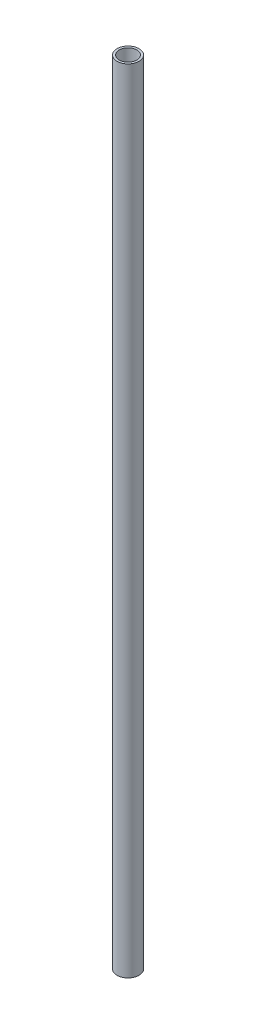
ISO-10303-21;
HEADER;
FILE_DESCRIPTION(('STEP AP214'),'2;1');
FILE_NAME('part.step','',(''),(''),'','','');
FILE_SCHEMA(('AUTOMOTIVE_DESIGN { 1 0 10303 214 1 1 1 1 }'));
ENDSEC;
DATA;
#1=APPLICATION_CONTEXT('core data for automotive mechanical design processes');
#2=APPLICATION_PROTOCOL_DEFINITION('international standard','automotive_design',2000,#1);
#3=PRODUCT_CONTEXT('',#1,'mechanical');
#4=PRODUCT('Part','Part','',(#3));
#5=PRODUCT_RELATED_PRODUCT_CATEGORY('part','',(#4));
#6=PRODUCT_DEFINITION_FORMATION('','',#4);
#7=PRODUCT_DEFINITION_CONTEXT('part definition',#1,'design');
#8=PRODUCT_DEFINITION('design','',#6,#7);
#9=PRODUCT_DEFINITION_SHAPE('','',#8);
#10=(LENGTH_UNIT() NAMED_UNIT(*) SI_UNIT(.MILLI.,.METRE.));
#11=(NAMED_UNIT(*) PLANE_ANGLE_UNIT() SI_UNIT($,.RADIAN.));
#12=(NAMED_UNIT(*) SI_UNIT($,.STERADIAN.) SOLID_ANGLE_UNIT());
#13=UNCERTAINTY_MEASURE_WITH_UNIT(LENGTH_MEASURE(1.E-05),#10,'distance_accuracy_value','');
#14=(GEOMETRIC_REPRESENTATION_CONTEXT(3) GLOBAL_UNCERTAINTY_ASSIGNED_CONTEXT((#13)) GLOBAL_UNIT_ASSIGNED_CONTEXT((#10,
#11,#12)) REPRESENTATION_CONTEXT('',''));
#15=CARTESIAN_POINT('',(0.,0.,0.));
#16=DIRECTION('',(0.,0.,1.));
#17=DIRECTION('',(1.,0.,0.));
#18=AXIS2_PLACEMENT_3D('',#15,#16,#17);
#19=CARTESIAN_POINT('',(33.0851957421032,180.,-40.358987491345));
#20=DIRECTION('',(0.,1.,0.));
#21=DIRECTION('',(0.,0.,1.));
#22=AXIS2_PLACEMENT_3D('',#19,#20,#21);
#23=PLANE('',#22);
#24=CARTESIAN_POINT('',(33.0851957421032,180.,-40.358987491345));
#25=DIRECTION('',(0.,1.,0.));
#26=DIRECTION('',(0.,0.,1.));
#27=AXIS2_PLACEMENT_3D('',#24,#25,#26);
#28=CIRCLE('',#27,2.5);
#29=CARTESIAN_POINT('',(33.0851957421032,180.,-42.858987491345));
#30=VERTEX_POINT('',#29);
#31=EDGE_CURVE('E10',#30,#30,#28,.T.);
#32=ORIENTED_EDGE('',*,*,#31,.T.);
#33=EDGE_LOOP('',(#32));
#34=FACE_BOUND('',#33,.T.);
#35=CARTESIAN_POINT('',(33.0851957421032,180.,-40.358987491345));
#36=DIRECTION('',(0.,1.,0.));
#37=DIRECTION('',(0.,0.,1.));
#38=AXIS2_PLACEMENT_3D('',#35,#36,#37);
#39=CIRCLE('',#38,2.);
#40=CARTESIAN_POINT('',(33.0851957421032,180.,-42.358987491345));
#41=VERTEX_POINT('',#40);
#42=EDGE_CURVE('E42',#41,#41,#39,.T.);
#43=ORIENTED_EDGE('',*,*,#42,.F.);
#44=EDGE_LOOP('',(#43));
#45=FACE_BOUND('',#44,.T.);
#46=ADVANCED_FACE('F31',(#34,#45),#23,.T.);
#47=CARTESIAN_POINT('',(33.0851957421032,0.,-40.358987491345));
#48=DIRECTION('',(0.,1.,0.));
#49=DIRECTION('',(0.,0.,1.));
#50=AXIS2_PLACEMENT_3D('',#47,#48,#49);
#51=PLANE('',#50);
#52=CARTESIAN_POINT('',(33.0851957421032,0.,-40.358987491345));
#53=DIRECTION('',(0.,1.,0.));
#54=DIRECTION('',(0.,0.,1.));
#55=AXIS2_PLACEMENT_3D('',#52,#53,#54);
#56=CIRCLE('',#55,2.5);
#57=CARTESIAN_POINT('',(33.0851957421032,0.,-42.858987491345));
#58=VERTEX_POINT('',#57);
#59=EDGE_CURVE('E35',#58,#58,#56,.T.);
#60=ORIENTED_EDGE('',*,*,#59,.F.);
#61=EDGE_LOOP('',(#60));
#62=FACE_BOUND('',#61,.T.);
#63=CARTESIAN_POINT('',(33.0851957421032,0.,-40.358987491345));
#64=DIRECTION('',(0.,1.,0.));
#65=DIRECTION('',(0.,0.,1.));
#66=AXIS2_PLACEMENT_3D('',#63,#64,#65);
#67=CIRCLE('',#66,2.);
#68=CARTESIAN_POINT('',(33.0851957421032,0.,-42.358987491345));
#69=VERTEX_POINT('',#68);
#70=EDGE_CURVE('E44',#69,#69,#67,.T.);
#71=ORIENTED_EDGE('',*,*,#70,.T.);
#72=EDGE_LOOP('',(#71));
#73=FACE_BOUND('',#72,.T.);
#74=ADVANCED_FACE('F54',(#62,#73),#51,.F.);
#75=CARTESIAN_POINT('',(33.0851957421032,180.,-40.358987491345));
#76=DIRECTION('',(0.,-1.,0.));
#77=DIRECTION('',(0.,0.,-1.));
#78=AXIS2_PLACEMENT_3D('',#75,#76,#77);
#79=CYLINDRICAL_SURFACE('',#78,2.5);
#80=CARTESIAN_POINT('',(33.0851957421032,180.,-42.858987491345));
#81=CARTESIAN_POINT('',(33.0851957421032,178.125,-42.858987491345));
#82=CARTESIAN_POINT('',(33.0851957421032,176.25,-42.858987491345));
#83=CARTESIAN_POINT('',(33.0851957421032,172.5,-42.858987491345));
#84=CARTESIAN_POINT('',(33.0851957421032,170.625,-42.858987491345));
#85=CARTESIAN_POINT('',(33.0851957421032,166.875,-42.858987491345));
#86=CARTESIAN_POINT('',(33.0851957421032,165.,-42.858987491345));
#87=CARTESIAN_POINT('',(33.0851957421032,161.25,-42.858987491345));
#88=CARTESIAN_POINT('',(33.0851957421032,159.375,-42.858987491345));
#89=CARTESIAN_POINT('',(33.0851957421032,155.625,-42.858987491345));
#90=CARTESIAN_POINT('',(33.0851957421032,153.75,-42.858987491345));
#91=CARTESIAN_POINT('',(33.0851957421032,150.,-42.858987491345));
#92=CARTESIAN_POINT('',(33.0851957421032,148.125,-42.858987491345));
#93=CARTESIAN_POINT('',(33.0851957421032,144.375,-42.858987491345));
#94=CARTESIAN_POINT('',(33.0851957421032,142.5,-42.858987491345));
#95=CARTESIAN_POINT('',(33.0851957421032,138.75,-42.858987491345));
#96=CARTESIAN_POINT('',(33.0851957421032,136.875,-42.858987491345));
#97=CARTESIAN_POINT('',(33.0851957421032,133.125,-42.858987491345));
#98=CARTESIAN_POINT('',(33.0851957421032,131.25,-42.858987491345));
#99=CARTESIAN_POINT('',(33.0851957421032,127.5,-42.858987491345));
#100=CARTESIAN_POINT('',(33.0851957421032,125.625,-42.858987491345));
#101=CARTESIAN_POINT('',(33.0851957421032,121.875,-42.858987491345));
#102=CARTESIAN_POINT('',(33.0851957421032,120.,-42.858987491345));
#103=CARTESIAN_POINT('',(33.0851957421032,116.25,-42.858987491345));
#104=CARTESIAN_POINT('',(33.0851957421032,114.375,-42.858987491345));
#105=CARTESIAN_POINT('',(33.0851957421032,110.625,-42.858987491345));
#106=CARTESIAN_POINT('',(33.0851957421032,108.75,-42.858987491345));
#107=CARTESIAN_POINT('',(33.0851957421032,105.,-42.858987491345));
#108=CARTESIAN_POINT('',(33.0851957421032,103.125,-42.858987491345));
#109=CARTESIAN_POINT('',(33.0851957421032,99.375,-42.858987491345));
#110=CARTESIAN_POINT('',(33.0851957421032,97.5,-42.858987491345));
#111=CARTESIAN_POINT('',(33.0851957421032,93.75,-42.858987491345));
#112=CARTESIAN_POINT('',(33.0851957421032,91.875,-42.858987491345));
#113=CARTESIAN_POINT('',(33.0851957421032,88.125,-42.858987491345));
#114=CARTESIAN_POINT('',(33.0851957421032,86.25,-42.858987491345));
#115=CARTESIAN_POINT('',(33.0851957421032,82.5,-42.858987491345));
#116=CARTESIAN_POINT('',(33.0851957421032,80.625,-42.858987491345));
#117=CARTESIAN_POINT('',(33.0851957421032,76.875,-42.858987491345));
#118=CARTESIAN_POINT('',(33.0851957421032,75.,-42.858987491345));
#119=CARTESIAN_POINT('',(33.0851957421032,71.25,-42.858987491345));
#120=CARTESIAN_POINT('',(33.0851957421032,69.375,-42.858987491345));
#121=CARTESIAN_POINT('',(33.0851957421032,65.625,-42.858987491345));
#122=CARTESIAN_POINT('',(33.0851957421032,63.75,-42.858987491345));
#123=CARTESIAN_POINT('',(33.0851957421032,60.,-42.858987491345));
#124=CARTESIAN_POINT('',(33.0851957421032,58.125,-42.858987491345));
#125=CARTESIAN_POINT('',(33.0851957421032,54.375,-42.858987491345));
#126=CARTESIAN_POINT('',(33.0851957421032,52.5,-42.858987491345));
#127=CARTESIAN_POINT('',(33.0851957421032,48.75,-42.858987491345));
#128=CARTESIAN_POINT('',(33.0851957421032,46.875,-42.858987491345));
#129=CARTESIAN_POINT('',(33.0851957421032,43.125,-42.858987491345));
#130=CARTESIAN_POINT('',(33.0851957421032,41.25,-42.858987491345));
#131=CARTESIAN_POINT('',(33.0851957421032,37.5,-42.858987491345));
#132=CARTESIAN_POINT('',(33.0851957421032,35.625,-42.858987491345));
#133=CARTESIAN_POINT('',(33.0851957421032,31.875,-42.858987491345));
#134=CARTESIAN_POINT('',(33.0851957421032,30.,-42.858987491345));
#135=CARTESIAN_POINT('',(33.0851957421032,26.25,-42.858987491345));
#136=CARTESIAN_POINT('',(33.0851957421032,24.375,-42.858987491345));
#137=CARTESIAN_POINT('',(33.0851957421032,20.625,-42.858987491345));
#138=CARTESIAN_POINT('',(33.0851957421032,18.75,-42.858987491345));
#139=CARTESIAN_POINT('',(33.0851957421032,15.,-42.858987491345));
#140=CARTESIAN_POINT('',(33.0851957421032,13.125,-42.858987491345));
#141=CARTESIAN_POINT('',(33.0851957421032,9.375,-42.858987491345));
#142=CARTESIAN_POINT('',(33.0851957421032,7.5,-42.858987491345));
#143=CARTESIAN_POINT('',(33.0851957421032,3.74999999999999,-42.858987491345));
#144=CARTESIAN_POINT('',(33.0851957421032,1.875,-42.858987491345));
#145=CARTESIAN_POINT('',(33.0851957421032,0.,-42.858987491345));
#146=B_SPLINE_CURVE_WITH_KNOTS('',3,(#80,#81,#82,#83,#84,#85,#86,#87,#88,#89,#90,#91,#92,#93,
#94,#95,#96,#97,#98,#99,#100,#101,#102,#103,#104,#105,#106,#107,#108,#109,#110,#111,#112,#113,
#114,#115,#116,#117,#118,#119,#120,#121,#122,#123,#124,#125,#126,#127,#128,#129,#130,#131,#132,
#133,#134,#135,#136,#137,#138,#139,#140,#141,#142,#143,#144,#145),.UNSPECIFIED.,.F.,.F.,(4,2,2,
2,2,2,2,2,2,2,2,2,2,2,2,2,2,2,2,2,2,2,2,2,2,2,2,2,2,2,2,2,4),(0.,5.62500000000002,11.25,16.875,
22.5,28.125,33.75,39.375,45.,50.625,56.25,61.875,67.5,73.125,78.75,84.375,90.,95.625,101.25,
106.875,112.5,118.125,123.75,129.375,135.,140.625,146.25,151.875,157.5,163.125,168.75,174.375,
180.),.UNSPECIFIED.);
#147=EDGE_CURVE('BSEAM33',#30,#58,#146,.T.);
#148=ORIENTED_EDGE('',*,*,#31,.F.);
#149=ORIENTED_EDGE('',*,*,#59,.T.);
#150=ORIENTED_EDGE('',*,*,#147,.T.);
#151=ORIENTED_EDGE('',*,*,#147,.F.);
#152=EDGE_LOOP('',(#148,#150,#149,#151));
#153=FACE_BOUND('',#152,.T.);
#154=ADVANCED_FACE('F33',(#153),#79,.T.);
#155=CARTESIAN_POINT('',(33.0851957421032,180.,-40.358987491345));
#156=DIRECTION('',(0.,-1.,0.));
#157=DIRECTION('',(0.,0.,-1.));
#158=AXIS2_PLACEMENT_3D('',#155,#156,#157);
#159=CYLINDRICAL_SURFACE('',#158,2.);
#160=CARTESIAN_POINT('',(33.0851957421032,180.,-42.358987491345));
#161=CARTESIAN_POINT('',(33.0851957421032,178.125,-42.358987491345));
#162=CARTESIAN_POINT('',(33.0851957421032,176.25,-42.358987491345));
#163=CARTESIAN_POINT('',(33.0851957421032,172.5,-42.358987491345));
#164=CARTESIAN_POINT('',(33.0851957421032,170.625,-42.358987491345));
#165=CARTESIAN_POINT('',(33.0851957421032,166.875,-42.358987491345));
#166=CARTESIAN_POINT('',(33.0851957421032,165.,-42.358987491345));
#167=CARTESIAN_POINT('',(33.0851957421032,161.25,-42.358987491345));
#168=CARTESIAN_POINT('',(33.0851957421032,159.375,-42.358987491345));
#169=CARTESIAN_POINT('',(33.0851957421032,155.625,-42.358987491345));
#170=CARTESIAN_POINT('',(33.0851957421032,153.75,-42.358987491345));
#171=CARTESIAN_POINT('',(33.0851957421032,150.,-42.358987491345));
#172=CARTESIAN_POINT('',(33.0851957421032,148.125,-42.358987491345));
#173=CARTESIAN_POINT('',(33.0851957421032,144.375,-42.358987491345));
#174=CARTESIAN_POINT('',(33.0851957421032,142.5,-42.358987491345));
#175=CARTESIAN_POINT('',(33.0851957421032,138.75,-42.358987491345));
#176=CARTESIAN_POINT('',(33.0851957421032,136.875,-42.358987491345));
#177=CARTESIAN_POINT('',(33.0851957421032,133.125,-42.358987491345));
#178=CARTESIAN_POINT('',(33.0851957421032,131.25,-42.358987491345));
#179=CARTESIAN_POINT('',(33.0851957421032,127.5,-42.358987491345));
#180=CARTESIAN_POINT('',(33.0851957421032,125.625,-42.358987491345));
#181=CARTESIAN_POINT('',(33.0851957421032,121.875,-42.358987491345));
#182=CARTESIAN_POINT('',(33.0851957421032,120.,-42.358987491345));
#183=CARTESIAN_POINT('',(33.0851957421032,116.25,-42.358987491345));
#184=CARTESIAN_POINT('',(33.0851957421032,114.375,-42.358987491345));
#185=CARTESIAN_POINT('',(33.0851957421032,110.625,-42.358987491345));
#186=CARTESIAN_POINT('',(33.0851957421032,108.75,-42.358987491345));
#187=CARTESIAN_POINT('',(33.0851957421032,105.,-42.358987491345));
#188=CARTESIAN_POINT('',(33.0851957421032,103.125,-42.358987491345));
#189=CARTESIAN_POINT('',(33.0851957421032,99.375,-42.358987491345));
#190=CARTESIAN_POINT('',(33.0851957421032,97.5,-42.358987491345));
#191=CARTESIAN_POINT('',(33.0851957421032,93.75,-42.358987491345));
#192=CARTESIAN_POINT('',(33.0851957421032,91.875,-42.358987491345));
#193=CARTESIAN_POINT('',(33.0851957421032,88.125,-42.358987491345));
#194=CARTESIAN_POINT('',(33.0851957421032,86.25,-42.358987491345));
#195=CARTESIAN_POINT('',(33.0851957421032,82.5,-42.358987491345));
#196=CARTESIAN_POINT('',(33.0851957421032,80.625,-42.358987491345));
#197=CARTESIAN_POINT('',(33.0851957421032,76.875,-42.358987491345));
#198=CARTESIAN_POINT('',(33.0851957421032,75.,-42.358987491345));
#199=CARTESIAN_POINT('',(33.0851957421032,71.25,-42.358987491345));
#200=CARTESIAN_POINT('',(33.0851957421032,69.375,-42.358987491345));
#201=CARTESIAN_POINT('',(33.0851957421032,65.625,-42.358987491345));
#202=CARTESIAN_POINT('',(33.0851957421032,63.75,-42.358987491345));
#203=CARTESIAN_POINT('',(33.0851957421032,60.,-42.358987491345));
#204=CARTESIAN_POINT('',(33.0851957421032,58.125,-42.358987491345));
#205=CARTESIAN_POINT('',(33.0851957421032,54.375,-42.358987491345));
#206=CARTESIAN_POINT('',(33.0851957421032,52.5,-42.358987491345));
#207=CARTESIAN_POINT('',(33.0851957421032,48.75,-42.358987491345));
#208=CARTESIAN_POINT('',(33.0851957421032,46.875,-42.358987491345));
#209=CARTESIAN_POINT('',(33.0851957421032,43.125,-42.358987491345));
#210=CARTESIAN_POINT('',(33.0851957421032,41.25,-42.358987491345));
#211=CARTESIAN_POINT('',(33.0851957421032,37.5,-42.358987491345));
#212=CARTESIAN_POINT('',(33.0851957421032,35.625,-42.358987491345));
#213=CARTESIAN_POINT('',(33.0851957421032,31.875,-42.358987491345));
#214=CARTESIAN_POINT('',(33.0851957421032,30.,-42.358987491345));
#215=CARTESIAN_POINT('',(33.0851957421032,26.25,-42.358987491345));
#216=CARTESIAN_POINT('',(33.0851957421032,24.375,-42.358987491345));
#217=CARTESIAN_POINT('',(33.0851957421032,20.625,-42.358987491345));
#218=CARTESIAN_POINT('',(33.0851957421032,18.75,-42.358987491345));
#219=CARTESIAN_POINT('',(33.0851957421032,15.,-42.358987491345));
#220=CARTESIAN_POINT('',(33.0851957421032,13.125,-42.358987491345));
#221=CARTESIAN_POINT('',(33.0851957421032,9.375,-42.358987491345));
#222=CARTESIAN_POINT('',(33.0851957421032,7.5,-42.358987491345));
#223=CARTESIAN_POINT('',(33.0851957421032,3.74999999999999,-42.358987491345));
#224=CARTESIAN_POINT('',(33.0851957421032,1.875,-42.358987491345));
#225=CARTESIAN_POINT('',(33.0851957421032,0.,-42.358987491345));
#226=B_SPLINE_CURVE_WITH_KNOTS('',3,(#160,#161,#162,#163,#164,#165,#166,#167,#168,#169,#170,
#171,#172,#173,#174,#175,#176,#177,#178,#179,#180,#181,#182,#183,#184,#185,#186,#187,#188,#189,
#190,#191,#192,#193,#194,#195,#196,#197,#198,#199,#200,#201,#202,#203,#204,#205,#206,#207,#208,
#209,#210,#211,#212,#213,#214,#215,#216,#217,#218,#219,#220,#221,#222,#223,#224,#225),
.UNSPECIFIED.,.F.,.F.,(4,2,2,2,2,2,2,2,2,2,2,2,2,2,2,2,2,2,2,2,2,2,2,2,2,2,2,2,2,2,2,2,4),(0.,
5.62500000000002,11.25,16.875,22.5,28.125,33.75,39.375,45.,50.625,56.25,61.875,67.5,73.125,
78.75,84.375,90.,95.625,101.25,106.875,112.5,118.125,123.75,129.375,135.,140.625,146.25,151.875,
157.5,163.125,168.75,174.375,180.),.UNSPECIFIED.);
#227=EDGE_CURVE('BSEAM50',#41,#69,#226,.T.);
#228=ORIENTED_EDGE('',*,*,#42,.T.);
#229=ORIENTED_EDGE('',*,*,#70,.F.);
#230=ORIENTED_EDGE('',*,*,#227,.T.);
#231=ORIENTED_EDGE('',*,*,#227,.F.);
#232=EDGE_LOOP('',(#228,#230,#229,#231));
#233=FACE_BOUND('',#232,.T.);
#234=ADVANCED_FACE('F50',(#233),#159,.F.);
#235=CLOSED_SHELL('',(#46,#74,#154,#234));
#236=MANIFOLD_SOLID_BREP('B2',#235);
#237=ADVANCED_BREP_SHAPE_REPRESENTATION('',(#18,#236),#14);
#238=SHAPE_DEFINITION_REPRESENTATION(#9,#237);
ENDSEC;
END-ISO-10303-21;
